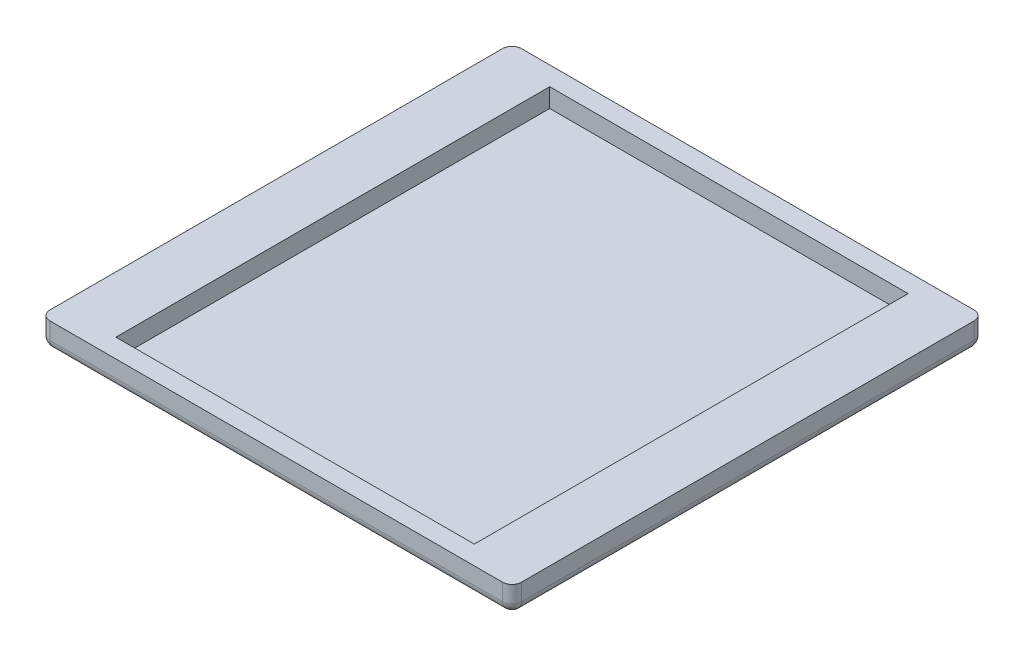
ISO-10303-21;
HEADER;
FILE_DESCRIPTION(('STEP AP214'),'2;1');
FILE_NAME('part.step','',(''),(''),'','','');
FILE_SCHEMA(('AUTOMOTIVE_DESIGN { 1 0 10303 214 1 1 1 1 }'));
ENDSEC;
DATA;
#1=APPLICATION_CONTEXT('core data for automotive mechanical design processes');
#2=APPLICATION_PROTOCOL_DEFINITION('international standard','automotive_design',2000,#1);
#3=PRODUCT_CONTEXT('',#1,'mechanical');
#4=PRODUCT('Part','Part','',(#3));
#5=PRODUCT_RELATED_PRODUCT_CATEGORY('part','',(#4));
#6=PRODUCT_DEFINITION_FORMATION('','',#4);
#7=PRODUCT_DEFINITION_CONTEXT('part definition',#1,'design');
#8=PRODUCT_DEFINITION('design','',#6,#7);
#9=PRODUCT_DEFINITION_SHAPE('','',#8);
#10=(LENGTH_UNIT() NAMED_UNIT(*) SI_UNIT(.MILLI.,.METRE.));
#11=(NAMED_UNIT(*) PLANE_ANGLE_UNIT() SI_UNIT($,.RADIAN.));
#12=(NAMED_UNIT(*) SI_UNIT($,.STERADIAN.) SOLID_ANGLE_UNIT());
#13=UNCERTAINTY_MEASURE_WITH_UNIT(LENGTH_MEASURE(1.E-05),#10,'distance_accuracy_value','');
#14=(GEOMETRIC_REPRESENTATION_CONTEXT(3) GLOBAL_UNCERTAINTY_ASSIGNED_CONTEXT((#13)) GLOBAL_UNIT_ASSIGNED_CONTEXT((#10,
#11,#12)) REPRESENTATION_CONTEXT('',''));
#15=CARTESIAN_POINT('',(0.,0.,0.));
#16=DIRECTION('',(0.,0.,1.));
#17=DIRECTION('',(1.,0.,0.));
#18=AXIS2_PLACEMENT_3D('',#15,#16,#17);
#19=CARTESIAN_POINT('',(125.,14.,125.));
#20=DIRECTION('',(-1.,0.,0.));
#21=DIRECTION('',(0.,0.,1.));
#22=AXIS2_PLACEMENT_3D('',#19,#20,#21);
#23=PLANE('',#22);
#24=DIRECTION('',(0.,0.,-1.));
#25=VECTOR('',#24,1.);
#26=CARTESIAN_POINT('',(125.,5.,-125.));
#27=LINE('',#26,#25);
#28=CARTESIAN_POINT('',(125.,5.,120.));
#29=VERTEX_POINT('',#28);
#30=CARTESIAN_POINT('',(125.,5.,-120.));
#31=VERTEX_POINT('',#30);
#32=EDGE_CURVE('E211',#29,#31,#27,.T.);
#33=ORIENTED_EDGE('',*,*,#32,.T.);
#34=DIRECTION('',(0.,-1.,0.));
#35=VECTOR('',#34,1.);
#36=CARTESIAN_POINT('',(125.,14.,-120.));
#37=LINE('',#36,#35);
#38=CARTESIAN_POINT('',(125.,14.,-120.));
#39=VERTEX_POINT('',#38);
#40=EDGE_CURVE('E240',#31,#39,#37,.F.);
#41=ORIENTED_EDGE('',*,*,#40,.T.);
#42=DIRECTION('',(0.,0.,-1.));
#43=VECTOR('',#42,1.);
#44=CARTESIAN_POINT('',(125.,14.,125.));
#45=LINE('',#44,#43);
#46=CARTESIAN_POINT('',(125.,14.,120.));
#47=VERTEX_POINT('',#46);
#48=EDGE_CURVE('E178',#47,#39,#45,.T.);
#49=ORIENTED_EDGE('',*,*,#48,.F.);
#50=DIRECTION('',(0.,-1.,0.));
#51=VECTOR('',#50,1.);
#52=CARTESIAN_POINT('',(125.,14.,120.));
#53=LINE('',#52,#51);
#54=EDGE_CURVE('E238',#47,#29,#53,.T.);
#55=ORIENTED_EDGE('',*,*,#54,.T.);
#56=EDGE_LOOP('',(#33,#41,#49,#55));
#57=FACE_BOUND('',#56,.T.);
#58=ADVANCED_FACE('F34',(#57),#23,.F.);
#59=CARTESIAN_POINT('',(-125.,14.,-125.));
#60=DIRECTION('',(0.,0.,1.));
#61=DIRECTION('',(1.,0.,0.));
#62=AXIS2_PLACEMENT_3D('',#59,#60,#61);
#63=PLANE('',#62);
#64=DIRECTION('',(-1.,0.,0.));
#65=VECTOR('',#64,1.);
#66=CARTESIAN_POINT('',(-125.,14.,-125.));
#67=LINE('',#66,#65);
#68=CARTESIAN_POINT('',(120.,14.,-125.));
#69=VERTEX_POINT('',#68);
#70=CARTESIAN_POINT('',(-120.,14.,-125.));
#71=VERTEX_POINT('',#70);
#72=EDGE_CURVE('E184',#69,#71,#67,.T.);
#73=ORIENTED_EDGE('',*,*,#72,.F.);
#74=DIRECTION('',(0.,-1.,0.));
#75=VECTOR('',#74,1.);
#76=CARTESIAN_POINT('',(120.,14.,-125.));
#77=LINE('',#76,#75);
#78=CARTESIAN_POINT('',(120.,5.,-125.));
#79=VERTEX_POINT('',#78);
#80=EDGE_CURVE('E236',#69,#79,#77,.T.);
#81=ORIENTED_EDGE('',*,*,#80,.T.);
#82=DIRECTION('',(-1.,0.,0.));
#83=VECTOR('',#82,1.);
#84=CARTESIAN_POINT('',(-125.,5.,-125.));
#85=LINE('',#84,#83);
#86=CARTESIAN_POINT('',(-120.,5.,-125.));
#87=VERTEX_POINT('',#86);
#88=EDGE_CURVE('E191',#79,#87,#85,.T.);
#89=ORIENTED_EDGE('',*,*,#88,.T.);
#90=DIRECTION('',(0.,-1.,0.));
#91=VECTOR('',#90,1.);
#92=CARTESIAN_POINT('',(-120.,14.,-125.));
#93=LINE('',#92,#91);
#94=EDGE_CURVE('E234',#87,#71,#93,.F.);
#95=ORIENTED_EDGE('',*,*,#94,.T.);
#96=EDGE_LOOP('',(#73,#81,#89,#95));
#97=FACE_BOUND('',#96,.T.);
#98=ADVANCED_FACE('F289',(#97),#63,.F.);
#99=CARTESIAN_POINT('',(-125.,14.,125.));
#100=DIRECTION('',(1.,0.,0.));
#101=DIRECTION('',(0.,0.,-1.));
#102=AXIS2_PLACEMENT_3D('',#99,#100,#101);
#103=PLANE('',#102);
#104=DIRECTION('',(0.,0.,1.));
#105=VECTOR('',#104,1.);
#106=CARTESIAN_POINT('',(-125.,14.,125.));
#107=LINE('',#106,#105);
#108=CARTESIAN_POINT('',(-125.,14.,-120.));
#109=VERTEX_POINT('',#108);
#110=CARTESIAN_POINT('',(-125.,14.,120.));
#111=VERTEX_POINT('',#110);
#112=EDGE_CURVE('E187',#109,#111,#107,.T.);
#113=ORIENTED_EDGE('',*,*,#112,.F.);
#114=DIRECTION('',(0.,-1.,0.));
#115=VECTOR('',#114,1.);
#116=CARTESIAN_POINT('',(-125.,14.,-120.));
#117=LINE('',#116,#115);
#118=CARTESIAN_POINT('',(-125.,5.,-120.));
#119=VERTEX_POINT('',#118);
#120=EDGE_CURVE('E11',#109,#119,#117,.T.);
#121=ORIENTED_EDGE('',*,*,#120,.T.);
#122=DIRECTION('',(0.,0.,1.));
#123=VECTOR('',#122,1.);
#124=CARTESIAN_POINT('',(-125.,5.,125.));
#125=LINE('',#124,#123);
#126=CARTESIAN_POINT('',(-125.,5.,120.));
#127=VERTEX_POINT('',#126);
#128=EDGE_CURVE('E206',#119,#127,#125,.T.);
#129=ORIENTED_EDGE('',*,*,#128,.T.);
#130=DIRECTION('',(0.,-1.,0.));
#131=VECTOR('',#130,1.);
#132=CARTESIAN_POINT('',(-125.,14.,120.));
#133=LINE('',#132,#131);
#134=EDGE_CURVE('E43',#127,#111,#133,.F.);
#135=ORIENTED_EDGE('',*,*,#134,.T.);
#136=EDGE_LOOP('',(#113,#121,#129,#135));
#137=FACE_BOUND('',#136,.T.);
#138=ADVANCED_FACE('F277',(#137),#103,.F.);
#139=CARTESIAN_POINT('',(-125.,14.,125.));
#140=DIRECTION('',(0.,0.,-1.));
#141=DIRECTION('',(-1.,0.,0.));
#142=AXIS2_PLACEMENT_3D('',#139,#140,#141);
#143=PLANE('',#142);
#144=DIRECTION('',(1.,0.,0.));
#145=VECTOR('',#144,1.);
#146=CARTESIAN_POINT('',(125.,5.,125.));
#147=LINE('',#146,#145);
#148=CARTESIAN_POINT('',(-120.,5.,125.));
#149=VERTEX_POINT('',#148);
#150=CARTESIAN_POINT('',(120.,5.,125.));
#151=VERTEX_POINT('',#150);
#152=EDGE_CURVE('E209',#149,#151,#147,.T.);
#153=ORIENTED_EDGE('',*,*,#152,.T.);
#154=DIRECTION('',(0.,-1.,0.));
#155=VECTOR('',#154,1.);
#156=CARTESIAN_POINT('',(120.,14.,125.));
#157=LINE('',#156,#155);
#158=CARTESIAN_POINT('',(120.,14.,125.));
#159=VERTEX_POINT('',#158);
#160=EDGE_CURVE('E51',#151,#159,#157,.F.);
#161=ORIENTED_EDGE('',*,*,#160,.T.);
#162=DIRECTION('',(1.,0.,0.));
#163=VECTOR('',#162,1.);
#164=CARTESIAN_POINT('',(-125.,14.,125.));
#165=LINE('',#164,#163);
#166=CARTESIAN_POINT('',(-120.,14.,125.));
#167=VERTEX_POINT('',#166);
#168=EDGE_CURVE('E189',#167,#159,#165,.T.);
#169=ORIENTED_EDGE('',*,*,#168,.F.);
#170=DIRECTION('',(0.,-1.,0.));
#171=VECTOR('',#170,1.);
#172=CARTESIAN_POINT('',(-120.,14.,125.));
#173=LINE('',#172,#171);
#174=EDGE_CURVE('E249',#167,#149,#173,.T.);
#175=ORIENTED_EDGE('',*,*,#174,.T.);
#176=EDGE_LOOP('',(#153,#161,#169,#175));
#177=FACE_BOUND('',#176,.T.);
#178=ADVANCED_FACE('F309',(#177),#143,.F.);
#179=CARTESIAN_POINT('',(0.,14.,0.));
#180=DIRECTION('',(0.,-1.,0.));
#181=DIRECTION('',(0.,0.,-1.));
#182=AXIS2_PLACEMENT_3D('',#179,#180,#181);
#183=PLANE('',#182);
#184=DIRECTION('',(0.,0.,1.));
#185=VECTOR('',#184,1.);
#186=CARTESIAN_POINT('',(-95.,14.,-115.));
#187=LINE('',#186,#185);
#188=CARTESIAN_POINT('',(-95.,14.,-115.));
#189=VERTEX_POINT('',#188);
#190=CARTESIAN_POINT('',(-94.9999999999999,14.,115.));
#191=VERTEX_POINT('',#190);
#192=EDGE_CURVE('E171',#189,#191,#187,.T.);
#193=ORIENTED_EDGE('',*,*,#192,.F.);
#194=DIRECTION('',(-1.,0.,0.));
#195=VECTOR('',#194,1.);
#196=CARTESIAN_POINT('',(-95.,14.,-115.));
#197=LINE('',#196,#195);
#198=CARTESIAN_POINT('',(95.,14.,-115.));
#199=VERTEX_POINT('',#198);
#200=EDGE_CURVE('E145',#199,#189,#197,.T.);
#201=ORIENTED_EDGE('',*,*,#200,.F.);
#202=DIRECTION('',(0.,0.,-1.));
#203=VECTOR('',#202,1.);
#204=CARTESIAN_POINT('',(95.,14.,-115.));
#205=LINE('',#204,#203);
#206=CARTESIAN_POINT('',(95.0000000000001,14.,115.));
#207=VERTEX_POINT('',#206);
#208=EDGE_CURVE('E162',#207,#199,#205,.T.);
#209=ORIENTED_EDGE('',*,*,#208,.F.);
#210=DIRECTION('',(1.,0.,0.));
#211=VECTOR('',#210,1.);
#212=CARTESIAN_POINT('',(-94.9999999999999,14.,115.));
#213=LINE('',#212,#211);
#214=EDGE_CURVE('E165',#191,#207,#213,.T.);
#215=ORIENTED_EDGE('',*,*,#214,.F.);
#216=EDGE_LOOP('',(#193,#201,#209,#215));
#217=FACE_BOUND('',#216,.T.);
#218=ORIENTED_EDGE('',*,*,#48,.T.);
#219=CARTESIAN_POINT('',(120.,14.,-120.));
#220=DIRECTION('',(0.,-1.,0.));
#221=DIRECTION('',(0.,0.,-1.));
#222=AXIS2_PLACEMENT_3D('',#219,#220,#221);
#223=CIRCLE('',#222,5.);
#224=EDGE_CURVE('E247',#39,#69,#223,.F.);
#225=ORIENTED_EDGE('',*,*,#224,.T.);
#226=ORIENTED_EDGE('',*,*,#72,.T.);
#227=CARTESIAN_POINT('',(-120.,14.,-120.));
#228=DIRECTION('',(0.,-1.,0.));
#229=DIRECTION('',(0.,0.,-1.));
#230=AXIS2_PLACEMENT_3D('',#227,#228,#229);
#231=CIRCLE('',#230,5.);
#232=EDGE_CURVE('E243',#71,#109,#231,.F.);
#233=ORIENTED_EDGE('',*,*,#232,.T.);
#234=ORIENTED_EDGE('',*,*,#112,.T.);
#235=CARTESIAN_POINT('',(-120.,14.,120.));
#236=DIRECTION('',(0.,-1.,0.));
#237=DIRECTION('',(0.,0.,-1.));
#238=AXIS2_PLACEMENT_3D('',#235,#236,#237);
#239=CIRCLE('',#238,5.);
#240=EDGE_CURVE('E58',#111,#167,#239,.F.);
#241=ORIENTED_EDGE('',*,*,#240,.T.);
#242=ORIENTED_EDGE('',*,*,#168,.T.);
#243=CARTESIAN_POINT('',(120.,14.,120.));
#244=DIRECTION('',(0.,-1.,0.));
#245=DIRECTION('',(0.,0.,-1.));
#246=AXIS2_PLACEMENT_3D('',#243,#244,#245);
#247=CIRCLE('',#246,5.);
#248=EDGE_CURVE('E245',#159,#47,#247,.F.);
#249=ORIENTED_EDGE('',*,*,#248,.T.);
#250=EDGE_LOOP('',(#218,#225,#226,#233,#234,#241,#242,#249));
#251=FACE_BOUND('',#250,.T.);
#252=ADVANCED_FACE('F470',(#217,#251),#183,.F.);
#253=CARTESIAN_POINT('',(0.,0.,0.));
#254=DIRECTION('',(0.,-1.,0.));
#255=DIRECTION('',(0.,0.,-1.));
#256=AXIS2_PLACEMENT_3D('',#253,#254,#255);
#257=PLANE('',#256);
#258=DIRECTION('',(0.,0.,1.));
#259=VECTOR('',#258,1.);
#260=CARTESIAN_POINT('',(-120.,0.,-125.));
#261=LINE('',#260,#259);
#262=CARTESIAN_POINT('',(-120.,0.,120.));
#263=VERTEX_POINT('',#262);
#264=CARTESIAN_POINT('',(-120.,0.,-120.));
#265=VERTEX_POINT('',#264);
#266=EDGE_CURVE('E200',#263,#265,#261,.F.);
#267=ORIENTED_EDGE('',*,*,#266,.T.);
#268=DIRECTION('',(-1.,0.,0.));
#269=VECTOR('',#268,1.);
#270=CARTESIAN_POINT('',(125.,0.,-120.));
#271=LINE('',#270,#269);
#272=CARTESIAN_POINT('',(120.,0.,-120.));
#273=VERTEX_POINT('',#272);
#274=EDGE_CURVE('E203',#265,#273,#271,.F.);
#275=ORIENTED_EDGE('',*,*,#274,.T.);
#276=DIRECTION('',(0.,0.,-1.));
#277=VECTOR('',#276,1.);
#278=CARTESIAN_POINT('',(120.,0.,125.));
#279=LINE('',#278,#277);
#280=CARTESIAN_POINT('',(120.,0.,120.));
#281=VERTEX_POINT('',#280);
#282=EDGE_CURVE('E194',#273,#281,#279,.F.);
#283=ORIENTED_EDGE('',*,*,#282,.T.);
#284=DIRECTION('',(1.,0.,0.));
#285=VECTOR('',#284,1.);
#286=CARTESIAN_POINT('',(-125.,0.,120.));
#287=LINE('',#286,#285);
#288=EDGE_CURVE('E197',#281,#263,#287,.F.);
#289=ORIENTED_EDGE('',*,*,#288,.T.);
#290=EDGE_LOOP('',(#267,#275,#283,#289));
#291=FACE_BOUND('',#290,.T.);
#292=ADVANCED_FACE('F305',(#291),#257,.T.);
#293=CARTESIAN_POINT('',(-95.,4.,-115.));
#294=DIRECTION('',(0.,0.,-1.));
#295=DIRECTION('',(-1.,0.,0.));
#296=AXIS2_PLACEMENT_3D('',#293,#294,#295);
#297=PLANE('',#296);
#298=ORIENTED_EDGE('',*,*,#200,.T.);
#299=DIRECTION('',(0.,1.,0.));
#300=VECTOR('',#299,1.);
#301=CARTESIAN_POINT('',(-95.,4.,-115.));
#302=LINE('',#301,#300);
#303=CARTESIAN_POINT('',(-95.,4.,-115.));
#304=VERTEX_POINT('',#303);
#305=EDGE_CURVE('E138',#304,#189,#302,.T.);
#306=ORIENTED_EDGE('',*,*,#305,.F.);
#307=DIRECTION('',(-1.,0.,0.));
#308=VECTOR('',#307,1.);
#309=CARTESIAN_POINT('',(-95.,4.,-115.));
#310=LINE('',#309,#308);
#311=CARTESIAN_POINT('',(95.,4.,-115.));
#312=VERTEX_POINT('',#311);
#313=EDGE_CURVE('E142',#312,#304,#310,.T.);
#314=ORIENTED_EDGE('',*,*,#313,.F.);
#315=DIRECTION('',(0.,1.,0.));
#316=VECTOR('',#315,1.);
#317=CARTESIAN_POINT('',(95.,4.,-115.));
#318=LINE('',#317,#316);
#319=EDGE_CURVE('E176',#312,#199,#318,.T.);
#320=ORIENTED_EDGE('',*,*,#319,.T.);
#321=EDGE_LOOP('',(#298,#306,#314,#320));
#322=FACE_BOUND('',#321,.T.);
#323=ADVANCED_FACE('F140',(#322),#297,.F.);
#324=CARTESIAN_POINT('',(95.,4.,-115.));
#325=DIRECTION('',(1.,0.,0.));
#326=DIRECTION('',(0.,0.,-1.));
#327=AXIS2_PLACEMENT_3D('',#324,#325,#326);
#328=PLANE('',#327);
#329=ORIENTED_EDGE('',*,*,#208,.T.);
#330=ORIENTED_EDGE('',*,*,#319,.F.);
#331=DIRECTION('',(0.,0.,-1.));
#332=VECTOR('',#331,1.);
#333=CARTESIAN_POINT('',(95.,4.,-115.));
#334=LINE('',#333,#332);
#335=CARTESIAN_POINT('',(95.0000000000001,4.,115.));
#336=VERTEX_POINT('',#335);
#337=EDGE_CURVE('E150',#336,#312,#334,.T.);
#338=ORIENTED_EDGE('',*,*,#337,.F.);
#339=DIRECTION('',(0.,1.,0.));
#340=VECTOR('',#339,1.);
#341=CARTESIAN_POINT('',(95.0000000000001,4.,115.));
#342=LINE('',#341,#340);
#343=EDGE_CURVE('E179',#336,#207,#342,.T.);
#344=ORIENTED_EDGE('',*,*,#343,.T.);
#345=EDGE_LOOP('',(#329,#330,#338,#344));
#346=FACE_BOUND('',#345,.T.);
#347=ADVANCED_FACE('F447',(#346),#328,.F.);
#348=CARTESIAN_POINT('',(-94.9999999999999,4.,115.));
#349=DIRECTION('',(0.,0.,1.));
#350=DIRECTION('',(1.,0.,0.));
#351=AXIS2_PLACEMENT_3D('',#348,#349,#350);
#352=PLANE('',#351);
#353=ORIENTED_EDGE('',*,*,#214,.T.);
#354=ORIENTED_EDGE('',*,*,#343,.F.);
#355=DIRECTION('',(1.,0.,0.));
#356=VECTOR('',#355,1.);
#357=CARTESIAN_POINT('',(-94.9999999999999,4.,115.));
#358=LINE('',#357,#356);
#359=CARTESIAN_POINT('',(-94.9999999999999,4.,115.));
#360=VERTEX_POINT('',#359);
#361=EDGE_CURVE('E158',#360,#336,#358,.T.);
#362=ORIENTED_EDGE('',*,*,#361,.F.);
#363=DIRECTION('',(0.,1.,0.));
#364=VECTOR('',#363,1.);
#365=CARTESIAN_POINT('',(-94.9999999999999,4.,115.));
#366=LINE('',#365,#364);
#367=EDGE_CURVE('E149',#360,#191,#366,.T.);
#368=ORIENTED_EDGE('',*,*,#367,.T.);
#369=EDGE_LOOP('',(#353,#354,#362,#368));
#370=FACE_BOUND('',#369,.T.);
#371=ADVANCED_FACE('F439',(#370),#352,.F.);
#372=CARTESIAN_POINT('',(-95.,4.,-115.));
#373=DIRECTION('',(-1.,0.,0.));
#374=DIRECTION('',(0.,0.,1.));
#375=AXIS2_PLACEMENT_3D('',#372,#373,#374);
#376=PLANE('',#375);
#377=ORIENTED_EDGE('',*,*,#192,.T.);
#378=ORIENTED_EDGE('',*,*,#367,.F.);
#379=DIRECTION('',(0.,0.,1.));
#380=VECTOR('',#379,1.);
#381=CARTESIAN_POINT('',(-95.,4.,-115.));
#382=LINE('',#381,#380);
#383=EDGE_CURVE('E153',#304,#360,#382,.T.);
#384=ORIENTED_EDGE('',*,*,#383,.F.);
#385=ORIENTED_EDGE('',*,*,#305,.T.);
#386=EDGE_LOOP('',(#377,#378,#384,#385));
#387=FACE_BOUND('',#386,.T.);
#388=ADVANCED_FACE('F154',(#387),#376,.F.);
#389=CARTESIAN_POINT('',(0.,4.,0.));
#390=DIRECTION('',(0.,-1.,0.));
#391=DIRECTION('',(0.,0.,-1.));
#392=AXIS2_PLACEMENT_3D('',#389,#390,#391);
#393=PLANE('',#392);
#394=ORIENTED_EDGE('',*,*,#313,.T.);
#395=ORIENTED_EDGE('',*,*,#383,.T.);
#396=ORIENTED_EDGE('',*,*,#361,.T.);
#397=ORIENTED_EDGE('',*,*,#337,.T.);
#398=EDGE_LOOP('',(#394,#395,#396,#397));
#399=FACE_BOUND('',#398,.T.);
#400=ADVANCED_FACE('F160',(#399),#393,.F.);
#401=CARTESIAN_POINT('',(-125.,5.,120.));
#402=DIRECTION('',(-1.,0.,0.));
#403=DIRECTION('',(0.,0.,1.));
#404=AXIS2_PLACEMENT_3D('',#401,#402,#403);
#405=CYLINDRICAL_SURFACE('',#404,5.);
#406=ORIENTED_EDGE('',*,*,#288,.F.);
#407=CARTESIAN_POINT('',(120.,5.,120.));
#408=DIRECTION('',(-1.,0.,0.));
#409=DIRECTION('',(0.,0.,1.));
#410=AXIS2_PLACEMENT_3D('',#407,#408,#409);
#411=CIRCLE('',#410,5.);
#412=EDGE_CURVE('E227',#281,#151,#411,.T.);
#413=ORIENTED_EDGE('',*,*,#412,.T.);
#414=ORIENTED_EDGE('',*,*,#152,.F.);
#415=CARTESIAN_POINT('',(-120.,5.,120.));
#416=DIRECTION('',(-1.,0.,0.));
#417=DIRECTION('',(0.,0.,1.));
#418=AXIS2_PLACEMENT_3D('',#415,#416,#417);
#419=CIRCLE('',#418,5.);
#420=EDGE_CURVE('E225',#149,#263,#419,.F.);
#421=ORIENTED_EDGE('',*,*,#420,.T.);
#422=EDGE_LOOP('',(#406,#413,#414,#421));
#423=FACE_BOUND('',#422,.T.);
#424=ADVANCED_FACE('F307',(#423),#405,.T.);
#425=CARTESIAN_POINT('',(120.,5.,125.));
#426=DIRECTION('',(0.,0.,1.));
#427=DIRECTION('',(1.,0.,0.));
#428=AXIS2_PLACEMENT_3D('',#425,#426,#427);
#429=CYLINDRICAL_SURFACE('',#428,5.);
#430=ORIENTED_EDGE('',*,*,#282,.F.);
#431=CARTESIAN_POINT('',(120.,5.,-120.));
#432=DIRECTION('',(0.,0.,1.));
#433=DIRECTION('',(1.,0.,0.));
#434=AXIS2_PLACEMENT_3D('',#431,#432,#433);
#435=CIRCLE('',#434,5.);
#436=EDGE_CURVE('E223',#273,#31,#435,.T.);
#437=ORIENTED_EDGE('',*,*,#436,.T.);
#438=ORIENTED_EDGE('',*,*,#32,.F.);
#439=CARTESIAN_POINT('',(120.,5.,120.));
#440=DIRECTION('',(0.,0.,1.));
#441=DIRECTION('',(1.,0.,0.));
#442=AXIS2_PLACEMENT_3D('',#439,#440,#441);
#443=CIRCLE('',#442,5.);
#444=EDGE_CURVE('E220',#29,#281,#443,.F.);
#445=ORIENTED_EDGE('',*,*,#444,.T.);
#446=EDGE_LOOP('',(#430,#437,#438,#445));
#447=FACE_BOUND('',#446,.T.);
#448=ADVANCED_FACE('F300',(#447),#429,.T.);
#449=CARTESIAN_POINT('',(-120.,5.,125.));
#450=DIRECTION('',(0.,0.,-1.));
#451=DIRECTION('',(-1.,0.,0.));
#452=AXIS2_PLACEMENT_3D('',#449,#450,#451);
#453=CYLINDRICAL_SURFACE('',#452,5.);
#454=ORIENTED_EDGE('',*,*,#128,.F.);
#455=CARTESIAN_POINT('',(-120.,5.,-120.));
#456=DIRECTION('',(0.,0.,-1.));
#457=DIRECTION('',(-1.,0.,0.));
#458=AXIS2_PLACEMENT_3D('',#455,#456,#457);
#459=CIRCLE('',#458,5.);
#460=EDGE_CURVE('E232',#119,#265,#459,.F.);
#461=ORIENTED_EDGE('',*,*,#460,.T.);
#462=ORIENTED_EDGE('',*,*,#266,.F.);
#463=CARTESIAN_POINT('',(-120.,5.,120.));
#464=DIRECTION('',(0.,0.,-1.));
#465=DIRECTION('',(-1.,0.,0.));
#466=AXIS2_PLACEMENT_3D('',#463,#464,#465);
#467=CIRCLE('',#466,5.);
#468=EDGE_CURVE('E229',#263,#127,#467,.T.);
#469=ORIENTED_EDGE('',*,*,#468,.T.);
#470=EDGE_LOOP('',(#454,#461,#462,#469));
#471=FACE_BOUND('',#470,.T.);
#472=ADVANCED_FACE('F276',(#471),#453,.T.);
#473=CARTESIAN_POINT('',(-125.,5.,-120.));
#474=DIRECTION('',(1.,0.,0.));
#475=DIRECTION('',(0.,0.,-1.));
#476=AXIS2_PLACEMENT_3D('',#473,#474,#475);
#477=CYLINDRICAL_SURFACE('',#476,5.);
#478=ORIENTED_EDGE('',*,*,#88,.F.);
#479=CARTESIAN_POINT('',(120.,5.,-120.));
#480=DIRECTION('',(1.,0.,0.));
#481=DIRECTION('',(0.,0.,-1.));
#482=AXIS2_PLACEMENT_3D('',#479,#480,#481);
#483=CIRCLE('',#482,5.);
#484=EDGE_CURVE('E217',#79,#273,#483,.F.);
#485=ORIENTED_EDGE('',*,*,#484,.T.);
#486=ORIENTED_EDGE('',*,*,#274,.F.);
#487=CARTESIAN_POINT('',(-120.,5.,-120.));
#488=DIRECTION('',(1.,0.,0.));
#489=DIRECTION('',(0.,0.,-1.));
#490=AXIS2_PLACEMENT_3D('',#487,#488,#489);
#491=CIRCLE('',#490,5.);
#492=EDGE_CURVE('E214',#265,#87,#491,.T.);
#493=ORIENTED_EDGE('',*,*,#492,.T.);
#494=EDGE_LOOP('',(#478,#485,#486,#493));
#495=FACE_BOUND('',#494,.T.);
#496=ADVANCED_FACE('F287',(#495),#477,.T.);
#497=CARTESIAN_POINT('',(120.,14.,-120.));
#498=DIRECTION('',(0.,-1.,0.));
#499=DIRECTION('',(0.,0.,-1.));
#500=AXIS2_PLACEMENT_3D('',#497,#498,#499);
#501=CYLINDRICAL_SURFACE('',#500,5.);
#502=ORIENTED_EDGE('',*,*,#224,.F.);
#503=ORIENTED_EDGE('',*,*,#40,.F.);
#504=CARTESIAN_POINT('',(120.,5.,-120.));
#505=DIRECTION('',(0.,-1.,0.));
#506=DIRECTION('',(0.,0.,-1.));
#507=AXIS2_PLACEMENT_3D('',#504,#505,#506);
#508=CIRCLE('',#507,5.);
#509=EDGE_CURVE('E172',#79,#31,#508,.T.);
#510=ORIENTED_EDGE('',*,*,#509,.F.);
#511=ORIENTED_EDGE('',*,*,#80,.F.);
#512=EDGE_LOOP('',(#502,#503,#510,#511));
#513=FACE_BOUND('',#512,.T.);
#514=ADVANCED_FACE('F293',(#513),#501,.T.);
#515=CARTESIAN_POINT('',(120.,5.,-120.));
#516=DIRECTION('',(0.,0.,1.));
#517=DIRECTION('',(1.,0.,0.));
#518=AXIS2_PLACEMENT_3D('',#515,#516,#517);
#519=SPHERICAL_SURFACE('',#518,5.);
#520=ORIENTED_EDGE('',*,*,#509,.T.);
#521=ORIENTED_EDGE('',*,*,#436,.F.);
#522=ORIENTED_EDGE('',*,*,#484,.F.);
#523=EDGE_LOOP('',(#520,#521,#522));
#524=FACE_BOUND('',#523,.T.);
#525=ADVANCED_FACE('F297',(#524),#519,.T.);
#526=CARTESIAN_POINT('',(120.,14.,120.));
#527=DIRECTION('',(0.,-1.,0.));
#528=DIRECTION('',(0.,0.,-1.));
#529=AXIS2_PLACEMENT_3D('',#526,#527,#528);
#530=CYLINDRICAL_SURFACE('',#529,5.);
#531=ORIENTED_EDGE('',*,*,#248,.F.);
#532=ORIENTED_EDGE('',*,*,#160,.F.);
#533=CARTESIAN_POINT('',(120.,5.,120.));
#534=DIRECTION('',(0.,-1.,0.));
#535=DIRECTION('',(0.,0.,-1.));
#536=AXIS2_PLACEMENT_3D('',#533,#534,#535);
#537=CIRCLE('',#536,5.);
#538=EDGE_CURVE('E255',#29,#151,#537,.T.);
#539=ORIENTED_EDGE('',*,*,#538,.F.);
#540=ORIENTED_EDGE('',*,*,#54,.F.);
#541=EDGE_LOOP('',(#531,#532,#539,#540));
#542=FACE_BOUND('',#541,.T.);
#543=ADVANCED_FACE('F313',(#542),#530,.T.);
#544=CARTESIAN_POINT('',(120.,5.,120.));
#545=DIRECTION('',(0.,0.,1.));
#546=DIRECTION('',(1.,0.,0.));
#547=AXIS2_PLACEMENT_3D('',#544,#545,#546);
#548=SPHERICAL_SURFACE('',#547,5.);
#549=ORIENTED_EDGE('',*,*,#538,.T.);
#550=ORIENTED_EDGE('',*,*,#412,.F.);
#551=ORIENTED_EDGE('',*,*,#444,.F.);
#552=EDGE_LOOP('',(#549,#550,#551));
#553=FACE_BOUND('',#552,.T.);
#554=ADVANCED_FACE('F316',(#553),#548,.T.);
#555=CARTESIAN_POINT('',(-120.,14.,-120.));
#556=DIRECTION('',(0.,-1.,0.));
#557=DIRECTION('',(0.,0.,-1.));
#558=AXIS2_PLACEMENT_3D('',#555,#556,#557);
#559=CYLINDRICAL_SURFACE('',#558,5.);
#560=ORIENTED_EDGE('',*,*,#232,.F.);
#561=ORIENTED_EDGE('',*,*,#94,.F.);
#562=CARTESIAN_POINT('',(-120.,5.,-120.));
#563=DIRECTION('',(0.,-1.,0.));
#564=DIRECTION('',(0.,0.,-1.));
#565=AXIS2_PLACEMENT_3D('',#562,#563,#564);
#566=CIRCLE('',#565,5.);
#567=EDGE_CURVE('E257',#119,#87,#566,.T.);
#568=ORIENTED_EDGE('',*,*,#567,.F.);
#569=ORIENTED_EDGE('',*,*,#120,.F.);
#570=EDGE_LOOP('',(#560,#561,#568,#569));
#571=FACE_BOUND('',#570,.T.);
#572=ADVANCED_FACE('F281',(#571),#559,.T.);
#573=CARTESIAN_POINT('',(-120.,5.,-120.));
#574=DIRECTION('',(0.,0.,1.));
#575=DIRECTION('',(1.,0.,0.));
#576=AXIS2_PLACEMENT_3D('',#573,#574,#575);
#577=SPHERICAL_SURFACE('',#576,5.);
#578=ORIENTED_EDGE('',*,*,#492,.F.);
#579=ORIENTED_EDGE('',*,*,#460,.F.);
#580=ORIENTED_EDGE('',*,*,#567,.T.);
#581=EDGE_LOOP('',(#578,#579,#580));
#582=FACE_BOUND('',#581,.T.);
#583=ADVANCED_FACE('F323',(#582),#577,.T.);
#584=CARTESIAN_POINT('',(-120.,14.,120.));
#585=DIRECTION('',(0.,-1.,0.));
#586=DIRECTION('',(0.,0.,-1.));
#587=AXIS2_PLACEMENT_3D('',#584,#585,#586);
#588=CYLINDRICAL_SURFACE('',#587,5.);
#589=ORIENTED_EDGE('',*,*,#240,.F.);
#590=ORIENTED_EDGE('',*,*,#134,.F.);
#591=CARTESIAN_POINT('',(-120.,5.,120.));
#592=DIRECTION('',(0.,-1.,0.));
#593=DIRECTION('',(0.,0.,-1.));
#594=AXIS2_PLACEMENT_3D('',#591,#592,#593);
#595=CIRCLE('',#594,5.);
#596=EDGE_CURVE('E38',#149,#127,#595,.T.);
#597=ORIENTED_EDGE('',*,*,#596,.F.);
#598=ORIENTED_EDGE('',*,*,#174,.F.);
#599=EDGE_LOOP('',(#589,#590,#597,#598));
#600=FACE_BOUND('',#599,.T.);
#601=ADVANCED_FACE('F36',(#600),#588,.T.);
#602=CARTESIAN_POINT('',(-120.,5.,120.));
#603=DIRECTION('',(0.,0.,1.));
#604=DIRECTION('',(1.,0.,0.));
#605=AXIS2_PLACEMENT_3D('',#602,#603,#604);
#606=SPHERICAL_SURFACE('',#605,5.);
#607=ORIENTED_EDGE('',*,*,#468,.F.);
#608=ORIENTED_EDGE('',*,*,#420,.F.);
#609=ORIENTED_EDGE('',*,*,#596,.T.);
#610=EDGE_LOOP('',(#607,#608,#609));
#611=FACE_BOUND('',#610,.T.);
#612=ADVANCED_FACE('F268',(#611),#606,.T.);
#613=CLOSED_SHELL('',(#58,#98,#138,#178,#252,#292,#323,#347,#371,#388,#400,#424,#448,#472,#496,
#514,#525,#543,#554,#572,#583,#601,#612));
#614=MANIFOLD_SOLID_BREP('B2',#613);
#615=ADVANCED_BREP_SHAPE_REPRESENTATION('',(#18,#614),#14);
#616=SHAPE_DEFINITION_REPRESENTATION(#9,#615);
ENDSEC;
END-ISO-10303-21;
